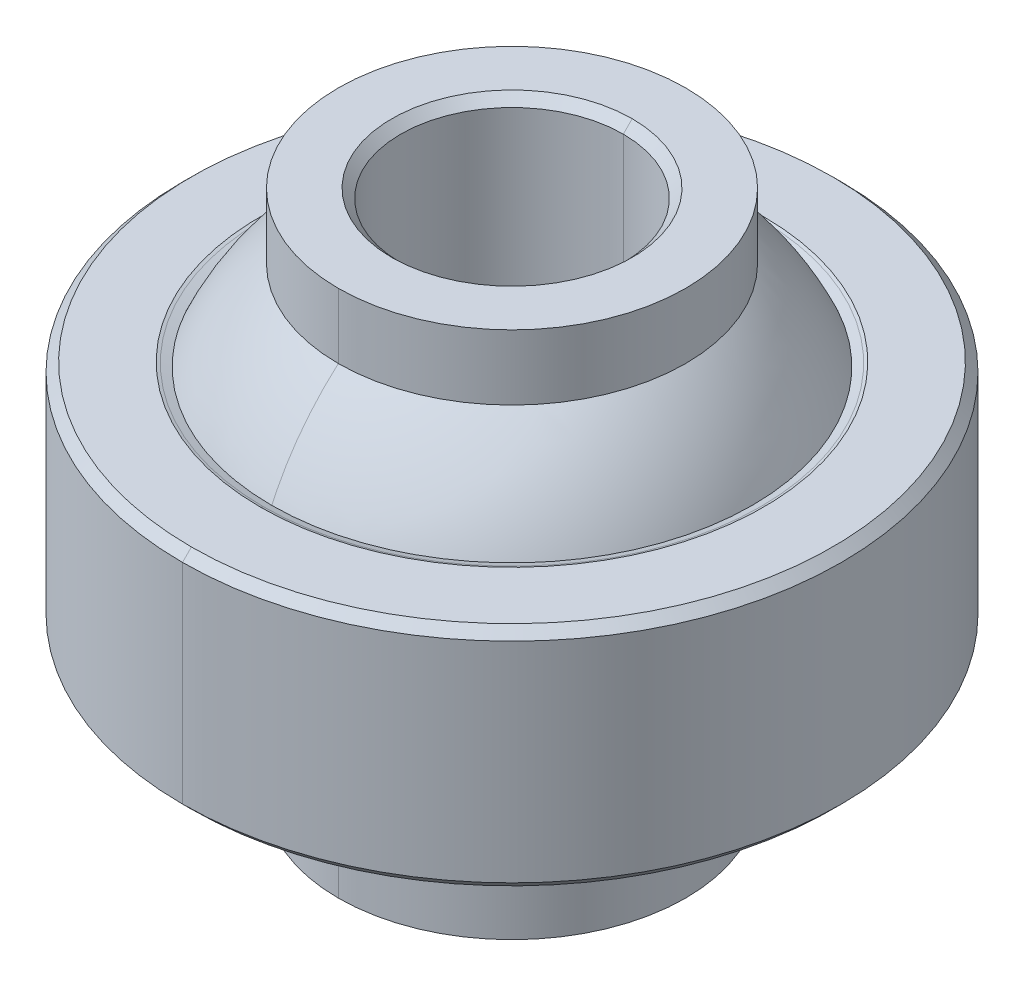
ISO-10303-21;
HEADER;
FILE_DESCRIPTION(('STEP AP214'),'2;1');
FILE_NAME('part.step','',(''),(''),'','','');
FILE_SCHEMA(('AUTOMOTIVE_DESIGN { 1 0 10303 214 1 1 1 1 }'));
ENDSEC;
DATA;
#1=APPLICATION_CONTEXT('core data for automotive mechanical design processes');
#2=APPLICATION_PROTOCOL_DEFINITION('international standard','automotive_design',2000,#1);
#3=PRODUCT_CONTEXT('',#1,'mechanical');
#4=PRODUCT('Part','Part','',(#3));
#5=PRODUCT_RELATED_PRODUCT_CATEGORY('part','',(#4));
#6=PRODUCT_DEFINITION_FORMATION('','',#4);
#7=PRODUCT_DEFINITION_CONTEXT('part definition',#1,'design');
#8=PRODUCT_DEFINITION('design','',#6,#7);
#9=PRODUCT_DEFINITION_SHAPE('','',#8);
#10=(LENGTH_UNIT() NAMED_UNIT(*) SI_UNIT(.MILLI.,.METRE.));
#11=(NAMED_UNIT(*) PLANE_ANGLE_UNIT() SI_UNIT($,.RADIAN.));
#12=(NAMED_UNIT(*) SI_UNIT($,.STERADIAN.) SOLID_ANGLE_UNIT());
#13=UNCERTAINTY_MEASURE_WITH_UNIT(LENGTH_MEASURE(1.E-05),#10,'distance_accuracy_value','');
#14=(GEOMETRIC_REPRESENTATION_CONTEXT(3) GLOBAL_UNCERTAINTY_ASSIGNED_CONTEXT((#13)) GLOBAL_UNIT_ASSIGNED_CONTEXT((#10,
#11,#12)) REPRESENTATION_CONTEXT('',''));
#15=CARTESIAN_POINT('',(0.,0.,0.));
#16=DIRECTION('',(0.,0.,1.));
#17=DIRECTION('',(1.,0.,0.));
#18=AXIS2_PLACEMENT_3D('',#15,#16,#17);
#19=CARTESIAN_POINT('',(0.,0.,0.));
#20=DIRECTION('',(0.,0.,1.));
#21=DIRECTION('',(1.,0.,0.));
#22=AXIS2_PLACEMENT_3D('',#19,#20,#21);
#23=SPHERICAL_SURFACE('',#22,7.5311);
#24=CARTESIAN_POINT('',(0.,0.,0.));
#25=DIRECTION('',(1.,0.,0.));
#26=DIRECTION('',(0.,0.,1.));
#27=AXIS2_PLACEMENT_3D('',#24,#25,#26);
#28=CIRCLE('',#27,7.5311);
#29=CARTESIAN_POINT('',(0.,-5.6732052853744,-4.953));
#30=VERTEX_POINT('',#29);
#31=CARTESIAN_POINT('',(0.,0.,-7.5311));
#32=VERTEX_POINT('',#31);
#33=EDGE_CURVE('P0_E162',#30,#32,#28,.T.);
#34=ORIENTED_EDGE('',*,*,#33,.T.);
#35=CARTESIAN_POINT('',(0.,0.,0.));
#36=DIRECTION('',(1.,0.,0.));
#37=DIRECTION('',(0.,0.,1.));
#38=AXIS2_PLACEMENT_3D('',#35,#36,#37);
#39=CIRCLE('',#38,7.5311);
#40=CARTESIAN_POINT('',(0.,5.6732052853744,-4.953));
#41=VERTEX_POINT('',#40);
#42=EDGE_CURVE('P0_E11',#32,#41,#39,.T.);
#43=ORIENTED_EDGE('',*,*,#42,.T.);
#44=CARTESIAN_POINT('',(0.,5.6732052853744,0.));
#45=DIRECTION('',(0.,-1.,0.));
#46=DIRECTION('',(0.,0.,-1.));
#47=AXIS2_PLACEMENT_3D('',#44,#45,#46);
#48=CIRCLE('',#47,4.953);
#49=CARTESIAN_POINT('',(0.,5.6732052853744,4.953));
#50=VERTEX_POINT('',#49);
#51=EDGE_CURVE('P0_E165',#41,#50,#48,.T.);
#52=ORIENTED_EDGE('',*,*,#51,.T.);
#53=CARTESIAN_POINT('',(0.,0.,0.));
#54=DIRECTION('',(1.,0.,0.));
#55=DIRECTION('',(0.,0.,1.));
#56=AXIS2_PLACEMENT_3D('',#53,#54,#55);
#57=CIRCLE('',#56,7.5311);
#58=CARTESIAN_POINT('',(0.,0.,7.5311));
#59=VERTEX_POINT('',#58);
#60=EDGE_CURVE('P0_E27',#50,#59,#57,.T.);
#61=ORIENTED_EDGE('',*,*,#60,.T.);
#62=CARTESIAN_POINT('',(0.,0.,0.));
#63=DIRECTION('',(1.,0.,0.));
#64=DIRECTION('',(0.,0.,1.));
#65=AXIS2_PLACEMENT_3D('',#62,#63,#64);
#66=CIRCLE('',#65,7.5311);
#67=CARTESIAN_POINT('',(0.,-5.6732052853744,4.953));
#68=VERTEX_POINT('',#67);
#69=EDGE_CURVE('P0_E159',#59,#68,#66,.T.);
#70=ORIENTED_EDGE('',*,*,#69,.T.);
#71=CARTESIAN_POINT('',(0.,-5.6732052853744,0.));
#72=DIRECTION('',(0.,1.,0.));
#73=DIRECTION('',(0.,0.,-1.));
#74=AXIS2_PLACEMENT_3D('',#71,#72,#73);
#75=CIRCLE('',#74,4.953);
#76=EDGE_CURVE('P0_E20',#68,#30,#75,.T.);
#77=ORIENTED_EDGE('',*,*,#76,.T.);
#78=EDGE_LOOP('',(#34,#43,#52,#61,#70,#77));
#79=FACE_BOUND('',#78,.T.);
#80=ADVANCED_FACE('P0_F16',(#79),#23,.T.);
#81=CARTESIAN_POINT('',(0.,0.,0.));
#82=DIRECTION('',(0.,0.,1.));
#83=DIRECTION('',(1.,0.,0.));
#84=AXIS2_PLACEMENT_3D('',#81,#82,#83);
#85=SPHERICAL_SURFACE('',#84,7.5311);
#86=ORIENTED_EDGE('',*,*,#33,.F.);
#87=CARTESIAN_POINT('',(0.,-5.6732052853744,0.));
#88=DIRECTION('',(0.,1.,0.));
#89=DIRECTION('',(0.,0.,-1.));
#90=AXIS2_PLACEMENT_3D('',#87,#88,#89);
#91=CIRCLE('',#90,4.953);
#92=EDGE_CURVE('P0_E151',#30,#68,#91,.T.);
#93=ORIENTED_EDGE('',*,*,#92,.T.);
#94=ORIENTED_EDGE('',*,*,#69,.F.);
#95=ORIENTED_EDGE('',*,*,#60,.F.);
#96=CARTESIAN_POINT('',(0.,5.6732052853744,0.));
#97=DIRECTION('',(0.,-1.,0.));
#98=DIRECTION('',(0.,0.,-1.));
#99=AXIS2_PLACEMENT_3D('',#96,#97,#98);
#100=CIRCLE('',#99,4.953);
#101=EDGE_CURVE('P0_E157',#50,#41,#100,.T.);
#102=ORIENTED_EDGE('',*,*,#101,.T.);
#103=ORIENTED_EDGE('',*,*,#42,.F.);
#104=EDGE_LOOP('',(#86,#93,#94,#95,#102,#103));
#105=FACE_BOUND('',#104,.T.);
#106=ADVANCED_FACE('P0_F245',(#105),#85,.T.);
#107=CARTESIAN_POINT('',(0.,0.,0.));
#108=DIRECTION('',(0.,1.,0.));
#109=DIRECTION('',(0.,0.,-1.));
#110=AXIS2_PLACEMENT_3D('',#107,#108,#109);
#111=CYLINDRICAL_SURFACE('',#110,4.953);
#112=DIRECTION('',(0.,1.,0.));
#113=VECTOR('',#112,1.);
#114=CARTESIAN_POINT('',(0.,0.,-4.953));
#115=LINE('',#114,#113);
#116=CARTESIAN_POINT('',(0.,7.5311,-4.953));
#117=VERTEX_POINT('',#116);
#118=EDGE_CURVE('P0_E154',#41,#117,#115,.T.);
#119=ORIENTED_EDGE('',*,*,#118,.T.);
#120=CARTESIAN_POINT('',(0.,7.5311,0.));
#121=DIRECTION('',(0.,1.,0.));
#122=DIRECTION('',(0.,0.,-1.));
#123=AXIS2_PLACEMENT_3D('',#120,#121,#122);
#124=CIRCLE('',#123,4.953);
#125=CARTESIAN_POINT('',(0.,7.5311,4.953));
#126=VERTEX_POINT('',#125);
#127=EDGE_CURVE('P0_E158',#126,#117,#124,.T.);
#128=ORIENTED_EDGE('',*,*,#127,.F.);
#129=DIRECTION('',(0.,-1.,0.));
#130=VECTOR('',#129,1.);
#131=CARTESIAN_POINT('',(0.,0.,4.953));
#132=LINE('',#131,#130);
#133=EDGE_CURVE('P0_E204',#126,#50,#132,.T.);
#134=ORIENTED_EDGE('',*,*,#133,.T.);
#135=ORIENTED_EDGE('',*,*,#51,.F.);
#136=EDGE_LOOP('',(#119,#128,#134,#135));
#137=FACE_BOUND('',#136,.T.);
#138=ADVANCED_FACE('P0_F243',(#137),#111,.T.);
#139=CARTESIAN_POINT('',(0.,0.,0.));
#140=DIRECTION('',(0.,1.,0.));
#141=DIRECTION('',(0.,0.,-1.));
#142=AXIS2_PLACEMENT_3D('',#139,#140,#141);
#143=CYLINDRICAL_SURFACE('',#142,4.953);
#144=DIRECTION('',(0.,1.,0.));
#145=VECTOR('',#144,1.);
#146=CARTESIAN_POINT('',(0.,0.,-4.953));
#147=LINE('',#146,#145);
#148=CARTESIAN_POINT('',(0.,-7.5311,-4.953));
#149=VERTEX_POINT('',#148);
#150=EDGE_CURVE('P0_E207',#149,#30,#147,.T.);
#151=ORIENTED_EDGE('',*,*,#150,.T.);
#152=ORIENTED_EDGE('',*,*,#76,.F.);
#153=DIRECTION('',(0.,-1.,0.));
#154=VECTOR('',#153,1.);
#155=CARTESIAN_POINT('',(0.,0.,4.953));
#156=LINE('',#155,#154);
#157=CARTESIAN_POINT('',(0.,-7.5311,4.953));
#158=VERTEX_POINT('',#157);
#159=EDGE_CURVE('P0_E150',#68,#158,#156,.T.);
#160=ORIENTED_EDGE('',*,*,#159,.T.);
#161=CARTESIAN_POINT('',(0.,-7.5311,0.));
#162=DIRECTION('',(0.,-1.,0.));
#163=DIRECTION('',(0.,0.,-1.));
#164=AXIS2_PLACEMENT_3D('',#161,#162,#163);
#165=CIRCLE('',#164,4.953);
#166=EDGE_CURVE('P0_E129',#149,#158,#165,.T.);
#167=ORIENTED_EDGE('',*,*,#166,.F.);
#168=EDGE_LOOP('',(#151,#152,#160,#167));
#169=FACE_BOUND('',#168,.T.);
#170=ADVANCED_FACE('P0_F251',(#169),#143,.T.);
#171=CARTESIAN_POINT('',(0.,0.,0.));
#172=DIRECTION('',(0.,1.,0.));
#173=DIRECTION('',(0.,0.,-1.));
#174=AXIS2_PLACEMENT_3D('',#171,#172,#173);
#175=CYLINDRICAL_SURFACE('',#174,4.953);
#176=ORIENTED_EDGE('',*,*,#150,.F.);
#177=CARTESIAN_POINT('',(0.,-7.5311,0.));
#178=DIRECTION('',(0.,-1.,0.));
#179=DIRECTION('',(0.,0.,-1.));
#180=AXIS2_PLACEMENT_3D('',#177,#178,#179);
#181=CIRCLE('',#180,4.953);
#182=EDGE_CURVE('P0_E217',#158,#149,#181,.T.);
#183=ORIENTED_EDGE('',*,*,#182,.F.);
#184=ORIENTED_EDGE('',*,*,#159,.F.);
#185=ORIENTED_EDGE('',*,*,#92,.F.);
#186=EDGE_LOOP('',(#176,#183,#184,#185));
#187=FACE_BOUND('',#186,.T.);
#188=ADVANCED_FACE('P0_F349',(#187),#175,.T.);
#189=CARTESIAN_POINT('',(0.,0.,0.));
#190=DIRECTION('',(0.,1.,0.));
#191=DIRECTION('',(0.,0.,-1.));
#192=AXIS2_PLACEMENT_3D('',#189,#190,#191);
#193=CYLINDRICAL_SURFACE('',#192,4.953);
#194=ORIENTED_EDGE('',*,*,#118,.F.);
#195=ORIENTED_EDGE('',*,*,#101,.F.);
#196=ORIENTED_EDGE('',*,*,#133,.F.);
#197=CARTESIAN_POINT('',(0.,7.5311,0.));
#198=DIRECTION('',(0.,1.,0.));
#199=DIRECTION('',(0.,0.,-1.));
#200=AXIS2_PLACEMENT_3D('',#197,#198,#199);
#201=CIRCLE('',#200,4.953);
#202=EDGE_CURVE('P0_E220',#117,#126,#201,.T.);
#203=ORIENTED_EDGE('',*,*,#202,.F.);
#204=EDGE_LOOP('',(#194,#195,#196,#203));
#205=FACE_BOUND('',#204,.T.);
#206=ADVANCED_FACE('P0_F240',(#205),#193,.T.);
#207=CARTESIAN_POINT('',(0.,7.5311,0.));
#208=DIRECTION('',(0.,1.,0.));
#209=DIRECTION('',(1.,0.,0.));
#210=AXIS2_PLACEMENT_3D('',#207,#208,#209);
#211=PLANE('',#210);
#212=ORIENTED_EDGE('',*,*,#202,.T.);
#213=ORIENTED_EDGE('',*,*,#127,.T.);
#214=EDGE_LOOP('',(#212,#213));
#215=FACE_BOUND('',#214,.T.);
#216=CARTESIAN_POINT('',(0.,7.5311,0.));
#217=DIRECTION('',(0.,-1.,0.));
#218=DIRECTION('',(0.,0.,-1.));
#219=AXIS2_PLACEMENT_3D('',#216,#217,#218);
#220=CIRCLE('',#219,3.429);
#221=CARTESIAN_POINT('',(0.,7.5311,-3.429));
#222=VERTEX_POINT('',#221);
#223=CARTESIAN_POINT('',(0.,7.5311,3.429));
#224=VERTEX_POINT('',#223);
#225=EDGE_CURVE('P0_E123',#222,#224,#220,.T.);
#226=ORIENTED_EDGE('',*,*,#225,.T.);
#227=CARTESIAN_POINT('',(0.,7.5311,0.));
#228=DIRECTION('',(0.,-1.,0.));
#229=DIRECTION('',(0.,0.,-1.));
#230=AXIS2_PLACEMENT_3D('',#227,#228,#229);
#231=CIRCLE('',#230,3.429);
#232=EDGE_CURVE('P0_E125',#224,#222,#231,.T.);
#233=ORIENTED_EDGE('',*,*,#232,.T.);
#234=EDGE_LOOP('',(#226,#233));
#235=FACE_BOUND('',#234,.T.);
#236=ADVANCED_FACE('P0_F124',(#215,#235),#211,.T.);
#237=CARTESIAN_POINT('',(0.,-7.5311,0.));
#238=DIRECTION('',(0.,-1.,0.));
#239=DIRECTION('',(0.,0.,-1.));
#240=AXIS2_PLACEMENT_3D('',#237,#238,#239);
#241=PLANE('',#240);
#242=ORIENTED_EDGE('',*,*,#166,.T.);
#243=ORIENTED_EDGE('',*,*,#182,.T.);
#244=EDGE_LOOP('',(#242,#243));
#245=FACE_BOUND('',#244,.T.);
#246=CARTESIAN_POINT('',(0.,-7.5311,0.));
#247=DIRECTION('',(0.,1.,0.));
#248=DIRECTION('',(0.,0.,-1.));
#249=AXIS2_PLACEMENT_3D('',#246,#247,#248);
#250=CIRCLE('',#249,3.429);
#251=CARTESIAN_POINT('',(0.,-7.5311,-3.429));
#252=VERTEX_POINT('',#251);
#253=CARTESIAN_POINT('',(0.,-7.5311,3.429));
#254=VERTEX_POINT('',#253);
#255=EDGE_CURVE('P0_E146',#252,#254,#250,.T.);
#256=ORIENTED_EDGE('',*,*,#255,.T.);
#257=CARTESIAN_POINT('',(0.,-7.5311,0.));
#258=DIRECTION('',(0.,1.,0.));
#259=DIRECTION('',(0.,0.,-1.));
#260=AXIS2_PLACEMENT_3D('',#257,#258,#259);
#261=CIRCLE('',#260,3.429);
#262=EDGE_CURVE('P0_E200',#254,#252,#261,.T.);
#263=ORIENTED_EDGE('',*,*,#262,.T.);
#264=EDGE_LOOP('',(#256,#263));
#265=FACE_BOUND('',#264,.T.);
#266=ADVANCED_FACE('P0_F278',(#245,#265),#241,.T.);
#267=CARTESIAN_POINT('',(0.,7.4041,0.));
#268=DIRECTION('',(0.,1.,0.));
#269=DIRECTION('',(0.,0.,-1.));
#270=AXIS2_PLACEMENT_3D('',#267,#268,#269);
#271=CONICAL_SURFACE('',#270,3.302,0.785398163397449);
#272=DIRECTION('',(0.,0.707106781186547,-0.707106781186548));
#273=VECTOR('',#272,1.);
#274=CARTESIAN_POINT('',(0.,7.4041,-3.302));
#275=LINE('',#274,#273);
#276=CARTESIAN_POINT('',(0.,7.2771,-3.175));
#277=VERTEX_POINT('',#276);
#278=EDGE_CURVE('P0_E138',#277,#222,#275,.T.);
#279=ORIENTED_EDGE('',*,*,#278,.F.);
#280=CARTESIAN_POINT('',(0.,7.2771,0.));
#281=DIRECTION('',(0.,1.,0.));
#282=DIRECTION('',(0.,0.,-1.));
#283=AXIS2_PLACEMENT_3D('',#280,#281,#282);
#284=CIRCLE('',#283,3.175);
#285=CARTESIAN_POINT('',(0.,7.2771,3.175));
#286=VERTEX_POINT('',#285);
#287=EDGE_CURVE('P0_E133',#286,#277,#284,.T.);
#288=ORIENTED_EDGE('',*,*,#287,.F.);
#289=DIRECTION('',(0.,-0.707106781186547,-0.707106781186548));
#290=VECTOR('',#289,1.);
#291=CARTESIAN_POINT('',(0.,7.4041,3.302));
#292=LINE('',#291,#290);
#293=EDGE_CURVE('P0_E116',#224,#286,#292,.T.);
#294=ORIENTED_EDGE('',*,*,#293,.F.);
#295=ORIENTED_EDGE('',*,*,#225,.F.);
#296=EDGE_LOOP('',(#279,#288,#294,#295));
#297=FACE_BOUND('',#296,.T.);
#298=ADVANCED_FACE('P0_F131',(#297),#271,.F.);
#299=CARTESIAN_POINT('',(0.,7.4041,0.));
#300=DIRECTION('',(0.,1.,0.));
#301=DIRECTION('',(0.,0.,-1.));
#302=AXIS2_PLACEMENT_3D('',#299,#300,#301);
#303=CONICAL_SURFACE('',#302,3.302,0.785398163397449);
#304=ORIENTED_EDGE('',*,*,#278,.T.);
#305=ORIENTED_EDGE('',*,*,#232,.F.);
#306=ORIENTED_EDGE('',*,*,#293,.T.);
#307=CARTESIAN_POINT('',(0.,7.2771,0.));
#308=DIRECTION('',(0.,1.,0.));
#309=DIRECTION('',(0.,0.,-1.));
#310=AXIS2_PLACEMENT_3D('',#307,#308,#309);
#311=CIRCLE('',#310,3.175);
#312=EDGE_CURVE('P0_E169',#277,#286,#311,.T.);
#313=ORIENTED_EDGE('',*,*,#312,.F.);
#314=EDGE_LOOP('',(#304,#305,#306,#313));
#315=FACE_BOUND('',#314,.T.);
#316=ADVANCED_FACE('P0_F137',(#315),#303,.F.);
#317=CARTESIAN_POINT('',(0.,-7.4041,0.));
#318=DIRECTION('',(0.,-1.,0.));
#319=DIRECTION('',(0.,0.,-1.));
#320=AXIS2_PLACEMENT_3D('',#317,#318,#319);
#321=CONICAL_SURFACE('',#320,3.302,0.785398163397449);
#322=DIRECTION('',(0.,-0.707106781186547,-0.707106781186548));
#323=VECTOR('',#322,1.);
#324=CARTESIAN_POINT('',(0.,-7.4041,-3.302));
#325=LINE('',#324,#323);
#326=CARTESIAN_POINT('',(0.,-7.2771,-3.175));
#327=VERTEX_POINT('',#326);
#328=EDGE_CURVE('P0_E194',#327,#252,#325,.T.);
#329=ORIENTED_EDGE('',*,*,#328,.F.);
#330=CARTESIAN_POINT('',(0.,-7.2771,0.));
#331=DIRECTION('',(0.,-1.,0.));
#332=DIRECTION('',(0.,0.,-1.));
#333=AXIS2_PLACEMENT_3D('',#330,#331,#332);
#334=CIRCLE('',#333,3.175);
#335=CARTESIAN_POINT('',(0.,-7.2771,3.175));
#336=VERTEX_POINT('',#335);
#337=EDGE_CURVE('P0_E168',#336,#327,#334,.T.);
#338=ORIENTED_EDGE('',*,*,#337,.F.);
#339=DIRECTION('',(0.,0.707106781186547,-0.707106781186548));
#340=VECTOR('',#339,1.);
#341=CARTESIAN_POINT('',(0.,-7.4041,3.302));
#342=LINE('',#341,#340);
#343=EDGE_CURVE('P0_E103',#254,#336,#342,.T.);
#344=ORIENTED_EDGE('',*,*,#343,.F.);
#345=ORIENTED_EDGE('',*,*,#255,.F.);
#346=EDGE_LOOP('',(#329,#338,#344,#345));
#347=FACE_BOUND('',#346,.T.);
#348=ADVANCED_FACE('P0_F290',(#347),#321,.F.);
#349=CARTESIAN_POINT('',(0.,-7.4041,0.));
#350=DIRECTION('',(0.,-1.,0.));
#351=DIRECTION('',(0.,0.,-1.));
#352=AXIS2_PLACEMENT_3D('',#349,#350,#351);
#353=CONICAL_SURFACE('',#352,3.302,0.785398163397449);
#354=ORIENTED_EDGE('',*,*,#328,.T.);
#355=ORIENTED_EDGE('',*,*,#262,.F.);
#356=ORIENTED_EDGE('',*,*,#343,.T.);
#357=CARTESIAN_POINT('',(0.,-7.2771,0.));
#358=DIRECTION('',(0.,-1.,0.));
#359=DIRECTION('',(0.,0.,-1.));
#360=AXIS2_PLACEMENT_3D('',#357,#358,#359);
#361=CIRCLE('',#360,3.175);
#362=EDGE_CURVE('P0_E178',#327,#336,#361,.T.);
#363=ORIENTED_EDGE('',*,*,#362,.F.);
#364=EDGE_LOOP('',(#354,#355,#356,#363));
#365=FACE_BOUND('',#364,.T.);
#366=ADVANCED_FACE('P0_F321',(#365),#353,.F.);
#367=CARTESIAN_POINT('',(0.,0.,0.));
#368=DIRECTION('',(0.,1.,0.));
#369=DIRECTION('',(0.,0.,-1.));
#370=AXIS2_PLACEMENT_3D('',#367,#368,#369);
#371=CYLINDRICAL_SURFACE('',#370,3.175);
#372=DIRECTION('',(0.,-1.,0.));
#373=VECTOR('',#372,1.);
#374=CARTESIAN_POINT('',(0.,0.,-3.175));
#375=LINE('',#374,#373);
#376=EDGE_CURVE('P0_E181',#277,#327,#375,.T.);
#377=ORIENTED_EDGE('',*,*,#376,.T.);
#378=ORIENTED_EDGE('',*,*,#362,.T.);
#379=DIRECTION('',(0.,1.,0.));
#380=VECTOR('',#379,1.);
#381=CARTESIAN_POINT('',(0.,0.,3.175));
#382=LINE('',#381,#380);
#383=EDGE_CURVE('P0_E166',#336,#286,#382,.T.);
#384=ORIENTED_EDGE('',*,*,#383,.T.);
#385=ORIENTED_EDGE('',*,*,#287,.T.);
#386=EDGE_LOOP('',(#377,#378,#384,#385));
#387=FACE_BOUND('',#386,.T.);
#388=ADVANCED_FACE('P0_F18',(#387),#371,.F.);
#389=CARTESIAN_POINT('',(0.,0.,0.));
#390=DIRECTION('',(0.,1.,0.));
#391=DIRECTION('',(0.,0.,-1.));
#392=AXIS2_PLACEMENT_3D('',#389,#390,#391);
#393=CYLINDRICAL_SURFACE('',#392,3.175);
#394=ORIENTED_EDGE('',*,*,#376,.F.);
#395=ORIENTED_EDGE('',*,*,#312,.T.);
#396=ORIENTED_EDGE('',*,*,#383,.F.);
#397=ORIENTED_EDGE('',*,*,#337,.T.);
#398=EDGE_LOOP('',(#394,#395,#396,#397));
#399=FACE_BOUND('',#398,.T.);
#400=ADVANCED_FACE('P0_F262',(#399),#393,.F.);
#401=CLOSED_SHELL('',(#80,#106,#138,#170,#188,#206,#236,#266,#298,#316,#348,#366,#388,#400));
#402=MANIFOLD_SOLID_BREP('P0_B1',#401);
#403=CARTESIAN_POINT('',(0.,0.,0.));
#404=DIRECTION('',(0.,1.,0.));
#405=DIRECTION('',(0.,0.,-1.));
#406=AXIS2_PLACEMENT_3D('',#403,#404,#405);
#407=CYLINDRICAL_SURFACE('',#406,9.398);
#408=DIRECTION('',(0.,1.,0.));
#409=VECTOR('',#408,1.);
#410=CARTESIAN_POINT('',(0.,0.,-9.398));
#411=LINE('',#410,#409);
#412=CARTESIAN_POINT('',(0.,-2.9845,-9.398));
#413=VERTEX_POINT('',#412);
#414=CARTESIAN_POINT('',(0.,2.9845,-9.398));
#415=VERTEX_POINT('',#414);
#416=EDGE_CURVE('P1_E31',#413,#415,#411,.T.);
#417=ORIENTED_EDGE('',*,*,#416,.F.);
#418=CARTESIAN_POINT('',(0.,-2.9845,0.));
#419=DIRECTION('',(0.,1.,0.));
#420=DIRECTION('',(0.,0.,-1.));
#421=AXIS2_PLACEMENT_3D('',#418,#419,#420);
#422=CIRCLE('',#421,9.398);
#423=CARTESIAN_POINT('',(0.,-2.9845,9.398));
#424=VERTEX_POINT('',#423);
#425=EDGE_CURVE('P1_E196',#413,#424,#422,.T.);
#426=ORIENTED_EDGE('',*,*,#425,.T.);
#427=DIRECTION('',(0.,-1.,0.));
#428=VECTOR('',#427,1.);
#429=CARTESIAN_POINT('',(0.,0.,9.398));
#430=LINE('',#429,#428);
#431=CARTESIAN_POINT('',(0.,2.9845,9.398));
#432=VERTEX_POINT('',#431);
#433=EDGE_CURVE('P1_E11',#432,#424,#430,.T.);
#434=ORIENTED_EDGE('',*,*,#433,.F.);
#435=CARTESIAN_POINT('',(0.,2.9845,0.));
#436=DIRECTION('',(0.,-1.,0.));
#437=DIRECTION('',(0.,0.,-1.));
#438=AXIS2_PLACEMENT_3D('',#435,#436,#437);
#439=CIRCLE('',#438,9.398);
#440=EDGE_CURVE('P1_E193',#432,#415,#439,.T.);
#441=ORIENTED_EDGE('',*,*,#440,.T.);
#442=EDGE_LOOP('',(#417,#426,#434,#441));
#443=FACE_BOUND('',#442,.T.);
#444=ADVANCED_FACE('P1_F17',(#443),#407,.T.);
#445=CARTESIAN_POINT('',(0.,0.,0.));
#446=DIRECTION('',(0.,1.,0.));
#447=DIRECTION('',(0.,0.,-1.));
#448=AXIS2_PLACEMENT_3D('',#445,#446,#447);
#449=CYLINDRICAL_SURFACE('',#448,9.398);
#450=ORIENTED_EDGE('',*,*,#416,.T.);
#451=CARTESIAN_POINT('',(0.,2.9845,0.));
#452=DIRECTION('',(0.,-1.,0.));
#453=DIRECTION('',(0.,0.,-1.));
#454=AXIS2_PLACEMENT_3D('',#451,#452,#453);
#455=CIRCLE('',#454,9.398);
#456=EDGE_CURVE('P1_E192',#415,#432,#455,.T.);
#457=ORIENTED_EDGE('',*,*,#456,.T.);
#458=ORIENTED_EDGE('',*,*,#433,.T.);
#459=CARTESIAN_POINT('',(0.,-2.9845,0.));
#460=DIRECTION('',(0.,1.,0.));
#461=DIRECTION('',(0.,0.,-1.));
#462=AXIS2_PLACEMENT_3D('',#459,#460,#461);
#463=CIRCLE('',#462,9.398);
#464=EDGE_CURVE('P1_E187',#424,#413,#463,.T.);
#465=ORIENTED_EDGE('',*,*,#464,.T.);
#466=EDGE_LOOP('',(#450,#457,#458,#465));
#467=FACE_BOUND('',#466,.T.);
#468=ADVANCED_FACE('P1_F237',(#467),#449,.T.);
#469=CARTESIAN_POINT('',(0.,-3.1115,0.));
#470=DIRECTION('',(0.,1.,0.));
#471=DIRECTION('',(0.,0.,-1.));
#472=AXIS2_PLACEMENT_3D('',#469,#470,#471);
#473=CONICAL_SURFACE('',#472,9.271,0.785398163397449);
#474=DIRECTION('',(0.,-0.707106781186547,0.707106781186548));
#475=VECTOR('',#474,1.);
#476=CARTESIAN_POINT('',(0.,-3.1115,-9.271));
#477=LINE('',#476,#475);
#478=CARTESIAN_POINT('',(0.,-3.2385,-9.144));
#479=VERTEX_POINT('',#478);
#480=EDGE_CURVE('P1_E203',#413,#479,#477,.T.);
#481=ORIENTED_EDGE('',*,*,#480,.T.);
#482=CARTESIAN_POINT('',(0.,-3.2385,0.));
#483=DIRECTION('',(0.,-1.,0.));
#484=DIRECTION('',(0.,0.,-1.));
#485=AXIS2_PLACEMENT_3D('',#482,#483,#484);
#486=CIRCLE('',#485,9.144);
#487=CARTESIAN_POINT('',(0.,-3.2385,9.144));
#488=VERTEX_POINT('',#487);
#489=EDGE_CURVE('P1_E206',#488,#479,#486,.T.);
#490=ORIENTED_EDGE('',*,*,#489,.F.);
#491=DIRECTION('',(0.,0.707106781186547,0.707106781186548));
#492=VECTOR('',#491,1.);
#493=CARTESIAN_POINT('',(0.,-3.1115,9.271));
#494=LINE('',#493,#492);
#495=EDGE_CURVE('P1_E182',#488,#424,#494,.T.);
#496=ORIENTED_EDGE('',*,*,#495,.T.);
#497=ORIENTED_EDGE('',*,*,#425,.F.);
#498=EDGE_LOOP('',(#481,#490,#496,#497));
#499=FACE_BOUND('',#498,.T.);
#500=ADVANCED_FACE('P1_F239',(#499),#473,.T.);
#501=CARTESIAN_POINT('',(0.,3.1115,0.));
#502=DIRECTION('',(0.,-1.,0.));
#503=DIRECTION('',(0.,0.,-1.));
#504=AXIS2_PLACEMENT_3D('',#501,#502,#503);
#505=CONICAL_SURFACE('',#504,9.271,0.785398163397449);
#506=DIRECTION('',(0.,0.707106781186547,0.707106781186548));
#507=VECTOR('',#506,1.);
#508=CARTESIAN_POINT('',(0.,3.1115,-9.271));
#509=LINE('',#508,#507);
#510=CARTESIAN_POINT('',(0.,3.2385,-9.144));
#511=VERTEX_POINT('',#510);
#512=EDGE_CURVE('P1_E186',#415,#511,#509,.T.);
#513=ORIENTED_EDGE('',*,*,#512,.F.);
#514=ORIENTED_EDGE('',*,*,#440,.F.);
#515=DIRECTION('',(0.,-0.707106781186547,0.707106781186548));
#516=VECTOR('',#515,1.);
#517=CARTESIAN_POINT('',(0.,3.1115,9.271));
#518=LINE('',#517,#516);
#519=CARTESIAN_POINT('',(0.,3.2385,9.144));
#520=VERTEX_POINT('',#519);
#521=EDGE_CURVE('P1_E188',#520,#432,#518,.T.);
#522=ORIENTED_EDGE('',*,*,#521,.F.);
#523=CARTESIAN_POINT('',(0.,3.2385,0.));
#524=DIRECTION('',(0.,1.,0.));
#525=DIRECTION('',(0.,0.,-1.));
#526=AXIS2_PLACEMENT_3D('',#523,#524,#525);
#527=CIRCLE('',#526,9.144);
#528=EDGE_CURVE('P1_E331',#511,#520,#527,.T.);
#529=ORIENTED_EDGE('',*,*,#528,.F.);
#530=EDGE_LOOP('',(#513,#514,#522,#529));
#531=FACE_BOUND('',#530,.T.);
#532=ADVANCED_FACE('P1_F242',(#531),#505,.T.);
#533=CARTESIAN_POINT('',(0.,3.1115,0.));
#534=DIRECTION('',(0.,-1.,0.));
#535=DIRECTION('',(0.,0.,-1.));
#536=AXIS2_PLACEMENT_3D('',#533,#534,#535);
#537=CONICAL_SURFACE('',#536,9.271,0.785398163397449);
#538=ORIENTED_EDGE('',*,*,#512,.T.);
#539=CARTESIAN_POINT('',(0.,3.2385,0.));
#540=DIRECTION('',(0.,1.,0.));
#541=DIRECTION('',(0.,0.,-1.));
#542=AXIS2_PLACEMENT_3D('',#539,#540,#541);
#543=CIRCLE('',#542,9.144);
#544=EDGE_CURVE('P1_E327',#520,#511,#543,.T.);
#545=ORIENTED_EDGE('',*,*,#544,.F.);
#546=ORIENTED_EDGE('',*,*,#521,.T.);
#547=ORIENTED_EDGE('',*,*,#456,.F.);
#548=EDGE_LOOP('',(#538,#545,#546,#547));
#549=FACE_BOUND('',#548,.T.);
#550=ADVANCED_FACE('P1_F244',(#549),#537,.T.);
#551=CARTESIAN_POINT('',(0.,-3.1115,0.));
#552=DIRECTION('',(0.,1.,0.));
#553=DIRECTION('',(0.,0.,-1.));
#554=AXIS2_PLACEMENT_3D('',#551,#552,#553);
#555=CONICAL_SURFACE('',#554,9.271,0.785398163397449);
#556=ORIENTED_EDGE('',*,*,#480,.F.);
#557=ORIENTED_EDGE('',*,*,#464,.F.);
#558=ORIENTED_EDGE('',*,*,#495,.F.);
#559=CARTESIAN_POINT('',(0.,-3.2385,0.));
#560=DIRECTION('',(0.,-1.,0.));
#561=DIRECTION('',(0.,0.,-1.));
#562=AXIS2_PLACEMENT_3D('',#559,#560,#561);
#563=CIRCLE('',#562,9.144);
#564=EDGE_CURVE('P1_E316',#479,#488,#563,.T.);
#565=ORIENTED_EDGE('',*,*,#564,.F.);
#566=EDGE_LOOP('',(#556,#557,#558,#565));
#567=FACE_BOUND('',#566,.T.);
#568=ADVANCED_FACE('P1_F247',(#567),#555,.T.);
#569=CARTESIAN_POINT('',(0.,-3.2385,0.));
#570=DIRECTION('',(0.,-1.,0.));
#571=DIRECTION('',(0.,0.,-1.));
#572=AXIS2_PLACEMENT_3D('',#569,#570,#571);
#573=PLANE('',#572);
#574=ORIENTED_EDGE('',*,*,#564,.T.);
#575=ORIENTED_EDGE('',*,*,#489,.T.);
#576=EDGE_LOOP('',(#574,#575));
#577=FACE_BOUND('',#576,.T.);
#578=CARTESIAN_POINT('',(0.,-3.2385,0.));
#579=DIRECTION('',(0.,1.,0.));
#580=DIRECTION('',(0.,0.,-1.));
#581=AXIS2_PLACEMENT_3D('',#578,#579,#580);
#582=CIRCLE('',#581,7.17578914510781);
#583=CARTESIAN_POINT('',(0.,-3.2385,-7.17578914510781));
#584=VERTEX_POINT('',#583);
#585=CARTESIAN_POINT('',(0.,-3.2385,7.17578914510781));
#586=VERTEX_POINT('',#585);
#587=EDGE_CURVE('P1_E78',#584,#586,#582,.T.);
#588=ORIENTED_EDGE('',*,*,#587,.T.);
#589=CARTESIAN_POINT('',(0.,-3.2385,0.));
#590=DIRECTION('',(0.,1.,0.));
#591=DIRECTION('',(0.,0.,-1.));
#592=AXIS2_PLACEMENT_3D('',#589,#590,#591);
#593=CIRCLE('',#592,7.17578914510781);
#594=EDGE_CURVE('P1_E209',#586,#584,#593,.T.);
#595=ORIENTED_EDGE('',*,*,#594,.T.);
#596=EDGE_LOOP('',(#588,#595));
#597=FACE_BOUND('',#596,.T.);
#598=ADVANCED_FACE('P1_F321',(#577,#597),#573,.T.);
#599=CARTESIAN_POINT('',(0.,3.2385,0.));
#600=DIRECTION('',(0.,1.,0.));
#601=DIRECTION('',(1.,0.,0.));
#602=AXIS2_PLACEMENT_3D('',#599,#600,#601);
#603=PLANE('',#602);
#604=ORIENTED_EDGE('',*,*,#528,.T.);
#605=ORIENTED_EDGE('',*,*,#544,.T.);
#606=EDGE_LOOP('',(#604,#605));
#607=FACE_BOUND('',#606,.T.);
#608=CARTESIAN_POINT('',(0.,3.2385,0.));
#609=DIRECTION('',(0.,-1.,0.));
#610=DIRECTION('',(0.,0.,-1.));
#611=AXIS2_PLACEMENT_3D('',#608,#609,#610);
#612=CIRCLE('',#611,7.17578914510781);
#613=CARTESIAN_POINT('',(0.,3.2385,-7.17578914510781));
#614=VERTEX_POINT('',#613);
#615=CARTESIAN_POINT('',(0.,3.2385,7.17578914510781));
#616=VERTEX_POINT('',#615);
#617=EDGE_CURVE('P1_E99',#614,#616,#612,.T.);
#618=ORIENTED_EDGE('',*,*,#617,.T.);
#619=CARTESIAN_POINT('',(0.,3.2385,0.));
#620=DIRECTION('',(0.,-1.,0.));
#621=DIRECTION('',(0.,0.,-1.));
#622=AXIS2_PLACEMENT_3D('',#619,#620,#621);
#623=CIRCLE('',#622,7.17578914510781);
#624=EDGE_CURVE('P1_E334',#616,#614,#623,.T.);
#625=ORIENTED_EDGE('',*,*,#624,.T.);
#626=EDGE_LOOP('',(#618,#625));
#627=FACE_BOUND('',#626,.T.);
#628=ADVANCED_FACE('P1_F347',(#607,#627),#603,.T.);
#629=CARTESIAN_POINT('',(0.,-3.16997259421795,0.));
#630=DIRECTION('',(0.,-1.,0.));
#631=DIRECTION('',(0.,0.,-1.));
#632=AXIS2_PLACEMENT_3D('',#629,#630,#631);
#633=CONICAL_SURFACE('',#632,6.98751164510781,1.22173047639603);
#634=DIRECTION('',(0.,0.342020143325669,0.939692620785908));
#635=VECTOR('',#634,1.);
#636=CARTESIAN_POINT('',(0.,-3.16997259421795,-6.98751164510781));
#637=LINE('',#636,#635);
#638=CARTESIAN_POINT('',(0.,-3.20846633095641,-7.09327231758719));
#639=VERTEX_POINT('',#638);
#640=EDGE_CURVE('P1_E199',#584,#639,#637,.T.);
#641=ORIENTED_EDGE('',*,*,#640,.T.);
#642=CARTESIAN_POINT('',(0.,-3.20846633095642,0.));
#643=DIRECTION('',(0.,1.,0.));
#644=DIRECTION('',(0.,0.,-1.));
#645=AXIS2_PLACEMENT_3D('',#642,#643,#644);
#646=CIRCLE('',#645,7.09327231758719);
#647=CARTESIAN_POINT('',(-7.09326597717362,-3.20848033323768,0.));
#648=VERTEX_POINT('',#647);
#649=EDGE_CURVE('P1_E366',#639,#648,#646,.T.);
#650=ORIENTED_EDGE('',*,*,#649,.T.);
#651=CARTESIAN_POINT('',(0.,-3.20846633095642,0.));
#652=DIRECTION('',(0.,1.,0.));
#653=DIRECTION('',(-1.,0.,0.));
#654=AXIS2_PLACEMENT_3D('',#651,#652,#653);
#655=CIRCLE('',#654,7.09327231758719);
#656=CARTESIAN_POINT('',(0.,-3.20846633095641,7.09327231758719));
#657=VERTEX_POINT('',#656);
#658=EDGE_CURVE('P1_E402',#648,#657,#655,.T.);
#659=ORIENTED_EDGE('',*,*,#658,.T.);
#660=DIRECTION('',(0.,-0.342020143325669,0.939692620785908));
#661=VECTOR('',#660,1.);
#662=CARTESIAN_POINT('',(0.,-3.16997259421795,6.98751164510781));
#663=LINE('',#662,#661);
#664=EDGE_CURVE('P1_E211',#657,#586,#663,.T.);
#665=ORIENTED_EDGE('',*,*,#664,.T.);
#666=ORIENTED_EDGE('',*,*,#587,.F.);
#667=EDGE_LOOP('',(#641,#650,#659,#665,#666));
#668=FACE_BOUND('',#667,.T.);
#669=ADVANCED_FACE('P1_F236',(#668),#633,.F.);
#670=CARTESIAN_POINT('',(0.,-3.16997259421795,0.));
#671=DIRECTION('',(0.,-1.,0.));
#672=DIRECTION('',(0.,0.,-1.));
#673=AXIS2_PLACEMENT_3D('',#670,#671,#672);
#674=CONICAL_SURFACE('',#673,6.98751164510781,1.22173047639603);
#675=ORIENTED_EDGE('',*,*,#640,.F.);
#676=ORIENTED_EDGE('',*,*,#594,.F.);
#677=ORIENTED_EDGE('',*,*,#664,.F.);
#678=CARTESIAN_POINT('',(0.,-3.20846633095642,0.));
#679=DIRECTION('',(0.,1.,0.));
#680=DIRECTION('',(0.,0.,1.));
#681=AXIS2_PLACEMENT_3D('',#678,#679,#680);
#682=CIRCLE('',#681,7.09327231758719);
#683=EDGE_CURVE('P1_E218',#657,#639,#682,.T.);
#684=ORIENTED_EDGE('',*,*,#683,.T.);
#685=EDGE_LOOP('',(#675,#676,#677,#684));
#686=FACE_BOUND('',#685,.T.);
#687=ADVANCED_FACE('P1_F225',(#686),#674,.F.);
#688=CARTESIAN_POINT('',(0.,3.16997259421795,0.));
#689=DIRECTION('',(0.,1.,0.));
#690=DIRECTION('',(0.,0.,-1.));
#691=AXIS2_PLACEMENT_3D('',#688,#689,#690);
#692=CONICAL_SURFACE('',#691,6.98751164510781,1.22173047639603);
#693=DIRECTION('',(0.,-0.342020143325669,0.939692620785908));
#694=VECTOR('',#693,1.);
#695=CARTESIAN_POINT('',(0.,3.16997259421794,-6.98751164510781));
#696=LINE('',#695,#694);
#697=CARTESIAN_POINT('',(0.,3.20846633095642,-7.09327231758719));
#698=VERTEX_POINT('',#697);
#699=EDGE_CURVE('P1_E336',#614,#698,#696,.T.);
#700=ORIENTED_EDGE('',*,*,#699,.T.);
#701=CARTESIAN_POINT('',(0.,3.20846633095642,0.));
#702=DIRECTION('',(0.,-1.,0.));
#703=DIRECTION('',(0.,0.,-1.));
#704=AXIS2_PLACEMENT_3D('',#701,#702,#703);
#705=CIRCLE('',#704,7.09327231758719);
#706=CARTESIAN_POINT('',(0.,3.20846633095642,7.09327231758719));
#707=VERTEX_POINT('',#706);
#708=EDGE_CURVE('P1_E294',#698,#707,#705,.T.);
#709=ORIENTED_EDGE('',*,*,#708,.T.);
#710=DIRECTION('',(0.,0.342020143325669,0.939692620785908));
#711=VECTOR('',#710,1.);
#712=CARTESIAN_POINT('',(0.,3.16997259421795,6.98751164510781));
#713=LINE('',#712,#711);
#714=EDGE_CURVE('P1_E200',#707,#616,#713,.T.);
#715=ORIENTED_EDGE('',*,*,#714,.T.);
#716=ORIENTED_EDGE('',*,*,#617,.F.);
#717=EDGE_LOOP('',(#700,#709,#715,#716));
#718=FACE_BOUND('',#717,.T.);
#719=ADVANCED_FACE('P1_F235',(#718),#692,.F.);
#720=CARTESIAN_POINT('',(0.,3.16997259421795,0.));
#721=DIRECTION('',(0.,1.,0.));
#722=DIRECTION('',(0.,0.,-1.));
#723=AXIS2_PLACEMENT_3D('',#720,#721,#722);
#724=CONICAL_SURFACE('',#723,6.98751164510781,1.22173047639603);
#725=ORIENTED_EDGE('',*,*,#699,.F.);
#726=ORIENTED_EDGE('',*,*,#624,.F.);
#727=ORIENTED_EDGE('',*,*,#714,.F.);
#728=CARTESIAN_POINT('',(0.,3.20846633095642,0.));
#729=DIRECTION('',(0.,-1.,0.));
#730=DIRECTION('',(0.,0.,1.));
#731=AXIS2_PLACEMENT_3D('',#728,#729,#730);
#732=CIRCLE('',#731,7.09327231758719);
#733=CARTESIAN_POINT('',(-7.09326597717362,3.20848033323768,0.));
#734=VERTEX_POINT('',#733);
#735=EDGE_CURVE('P1_E292',#707,#734,#732,.T.);
#736=ORIENTED_EDGE('',*,*,#735,.T.);
#737=CARTESIAN_POINT('',(0.,3.20846633095642,0.));
#738=DIRECTION('',(0.,-1.,0.));
#739=DIRECTION('',(-1.,0.,0.));
#740=AXIS2_PLACEMENT_3D('',#737,#738,#739);
#741=CIRCLE('',#740,7.09327231758719);
#742=EDGE_CURVE('P1_E282',#734,#698,#741,.T.);
#743=ORIENTED_EDGE('',*,*,#742,.T.);
#744=EDGE_LOOP('',(#725,#726,#727,#736,#743));
#745=FACE_BOUND('',#744,.T.);
#746=ADVANCED_FACE('P1_F255',(#745),#724,.F.);
#747=CARTESIAN_POINT('',(0.,-1.93332228878696,0.));
#748=DIRECTION('',(0.,-1.,0.));
#749=DIRECTION('',(1.,0.,0.));
#750=AXIS2_PLACEMENT_3D('',#747,#748,#749);
#751=CONICAL_SURFACE('',#750,3.58789457255391,1.22190500932123);
#752=CARTESIAN_POINT('',(0.,-3.12138692190335,0.));
#753=DIRECTION('',(0.,-1.,0.));
#754=DIRECTION('',(1.,0.,0.));
#755=AXIS2_PLACEMENT_3D('',#752,#753,#754);
#756=CIRCLE('',#755,6.85384878888803);
#757=CARTESIAN_POINT('',(-6.85384878888803,-3.12138692190335,0.));
#758=VERTEX_POINT('',#757);
#759=CARTESIAN_POINT('',(6.85384878888803,-3.12138692190335,0.));
#760=VERTEX_POINT('',#759);
#761=EDGE_CURVE('P1_E151',#758,#760,#756,.T.);
#762=ORIENTED_EDGE('',*,*,#761,.F.);
#763=CARTESIAN_POINT('',(0.,-3.12138692190335,0.));
#764=DIRECTION('',(0.,-1.,0.));
#765=DIRECTION('',(1.,0.,0.));
#766=AXIS2_PLACEMENT_3D('',#763,#764,#765);
#767=CIRCLE('',#766,6.85384878888803);
#768=EDGE_CURVE('P1_E163',#760,#758,#767,.T.);
#769=ORIENTED_EDGE('',*,*,#768,.F.);
#770=EDGE_LOOP('',(#762,#769));
#771=FACE_BOUND('',#770,.T.);
#772=ORIENTED_EDGE('',*,*,#658,.F.);
#773=ORIENTED_EDGE('',*,*,#649,.F.);
#774=ORIENTED_EDGE('',*,*,#683,.F.);
#775=EDGE_LOOP('',(#772,#773,#774));
#776=FACE_BOUND('',#775,.T.);
#777=ADVANCED_FACE('P1_F165',(#771,#776),#751,.F.);
#778=CARTESIAN_POINT('',(0.,1.93332228878696,0.));
#779=DIRECTION('',(0.,1.,0.));
#780=DIRECTION('',(1.,0.,0.));
#781=AXIS2_PLACEMENT_3D('',#778,#779,#780);
#782=CONICAL_SURFACE('',#781,3.58789457255391,1.22190500932123);
#783=CARTESIAN_POINT('',(0.,3.12138692190335,0.));
#784=DIRECTION('',(0.,1.,0.));
#785=DIRECTION('',(1.,0.,0.));
#786=AXIS2_PLACEMENT_3D('',#783,#784,#785);
#787=CIRCLE('',#786,6.85384878888803);
#788=CARTESIAN_POINT('',(-6.85384878888803,3.12138692190335,0.));
#789=VERTEX_POINT('',#788);
#790=CARTESIAN_POINT('',(6.85384878888803,3.12138692190335,0.));
#791=VERTEX_POINT('',#790);
#792=EDGE_CURVE('P1_E171',#789,#791,#787,.T.);
#793=ORIENTED_EDGE('',*,*,#792,.F.);
#794=CARTESIAN_POINT('',(0.,3.12138692190335,0.));
#795=DIRECTION('',(0.,1.,0.));
#796=DIRECTION('',(1.,0.,0.));
#797=AXIS2_PLACEMENT_3D('',#794,#795,#796);
#798=CIRCLE('',#797,6.85384878888803);
#799=EDGE_CURVE('P1_E162',#791,#789,#798,.T.);
#800=ORIENTED_EDGE('',*,*,#799,.F.);
#801=EDGE_LOOP('',(#793,#800));
#802=FACE_BOUND('',#801,.T.);
#803=ORIENTED_EDGE('',*,*,#742,.F.);
#804=ORIENTED_EDGE('',*,*,#735,.F.);
#805=ORIENTED_EDGE('',*,*,#708,.F.);
#806=EDGE_LOOP('',(#803,#804,#805));
#807=FACE_BOUND('',#806,.T.);
#808=ADVANCED_FACE('P1_F250',(#802,#807),#782,.F.);
#809=CARTESIAN_POINT('',(0.,-7.5242173600733,0.));
#810=CARTESIAN_POINT('',(0.,-7.5242173600733,0.));
#811=CARTESIAN_POINT('',(0.,-7.5242173600733,0.));
#812=CARTESIAN_POINT('',(0.,-7.5242173600733,0.));
#813=CARTESIAN_POINT('',(0.,-7.5242173600733,0.));
#814=CARTESIAN_POINT('',(-4.34749624410656,-7.5286201995707,0.));
#815=CARTESIAN_POINT('',(-4.34749624410655,-7.5286201995707,-4.34749624410655));
#816=CARTESIAN_POINT('',(0.,-7.52862019957072,-4.34749624410656));
#817=CARTESIAN_POINT('',(4.34749624410655,-7.52862019957072,-4.34749624410655));
#818=CARTESIAN_POINT('',(4.34749624410655,-7.52862019957072,0.));
#819=CARTESIAN_POINT('',(-6.52251634750104,-3.76431009978536,0.));
#820=CARTESIAN_POINT('',(-6.52251634750104,-3.76431009978536,-6.52251634750104));
#821=CARTESIAN_POINT('',(0.,-3.76431009978536,-6.52251634750104));
#822=CARTESIAN_POINT('',(6.52251634750104,-3.76431009978536,-6.52251634750104));
#823=CARTESIAN_POINT('',(6.52251634750104,-3.76431009978536,0.));
#824=CARTESIAN_POINT('',(-8.69753645089553,0.,0.));
#825=CARTESIAN_POINT('',(-8.69753645089554,0.,-8.69753645089554));
#826=CARTESIAN_POINT('',(0.,0.,-8.69753645089553));
#827=CARTESIAN_POINT('',(8.69753645089554,0.,-8.69753645089554));
#828=CARTESIAN_POINT('',(8.69753645089553,0.,0.));
#829=CARTESIAN_POINT('',(-6.52251634750104,3.76431009978537,0.));
#830=CARTESIAN_POINT('',(-6.52251634750104,3.76431009978537,-6.52251634750104));
#831=CARTESIAN_POINT('',(0.,3.76431009978537,-6.52251634750104));
#832=CARTESIAN_POINT('',(6.52251634750104,3.76431009978537,-6.52251634750104));
#833=CARTESIAN_POINT('',(6.52251634750104,3.76431009978537,0.));
#834=CARTESIAN_POINT('',(-4.34749624410656,7.52862019957073,0.));
#835=CARTESIAN_POINT('',(-4.34749624410655,7.52862019957073,-4.34749624410655));
#836=CARTESIAN_POINT('',(0.,7.52862019957073,-4.34749624410656));
#837=CARTESIAN_POINT('',(4.34749624410656,7.52862019957073,-4.34749624410655));
#838=CARTESIAN_POINT('',(4.34749624410656,7.52862019957073,0.));
#839=CARTESIAN_POINT('',(0.,7.52421736007331,0.));
#840=CARTESIAN_POINT('',(0.,7.52421736007332,0.));
#841=CARTESIAN_POINT('',(0.,7.52421736007331,0.));
#842=CARTESIAN_POINT('',(0.,7.52421736007332,0.));
#843=CARTESIAN_POINT('',(0.,7.52421736007331,0.));
#844=(BOUNDED_SURFACE() B_SPLINE_SURFACE(2,2,((#809,#810,#811,#812,#813),(#814,#815,#816,#817,
#818),(#819,#820,#821,#822,#823),(#824,#825,#826,#827,#828),(#829,#830,#831,#832,#833),(#834,
#835,#836,#837,#838),(#839,#840,#841,#842,#843)),.UNSPECIFIED.,.F.,.F.,
.F.) B_SPLINE_SURFACE_WITH_KNOTS((3,2,2,3),(3,2,3),(1.56978359722712,2.6176563014689,
3.66552900571068,4.71340170995247),(3.14159265358979,4.71238898038469,6.28318530717959),
.UNSPECIFIED.) GEOMETRIC_REPRESENTATION_ITEM() RATIONAL_B_SPLINE_SURFACE(((1.,0.707106781186548,
1.,0.707106781186548,1.),(0.865856566181128,0.612253049481574,0.865856566181128,
0.612253049481574,0.865856566181128),(1.,0.707106781186548,1.,0.707106781186548,1.),
(0.865856566181127,0.612253049481573,0.865856566181127,0.612253049481573,0.865856566181127),(1.,
0.707106781186548,1.,0.707106781186548,1.),(0.865856566181127,0.612253049481573,
0.865856566181127,0.612253049481573,0.865856566181127),(1.,0.707106781186548,1.,
0.707106781186548,1.))) REPRESENTATION_ITEM('') SURFACE());
#845=CARTESIAN_POINT('',(-0.00761999999999916,0.,0.));
#846=DIRECTION('',(0.,0.,-1.));
#847=DIRECTION('',(-1.,0.,0.));
#848=AXIS2_PLACEMENT_3D('',#845,#846,#847);
#849=CIRCLE('',#848,7.52422121857329);
#850=EDGE_CURVE('P1_E158',#758,#789,#849,.T.);
#851=CARTESIAN_POINT('',(0.00761999999999916,0.,0.));
#852=DIRECTION('',(0.,0.,-1.));
#853=DIRECTION('',(1.,0.,0.));
#854=AXIS2_PLACEMENT_3D('',#851,#852,#853);
#855=CIRCLE('',#854,7.52422121857329);
#856=EDGE_CURVE('P1_E155',#791,#760,#855,.T.);
#857=ORIENTED_EDGE('',*,*,#850,.F.);
#858=ORIENTED_EDGE('',*,*,#761,.T.);
#859=ORIENTED_EDGE('',*,*,#856,.F.);
#860=ORIENTED_EDGE('',*,*,#799,.T.);
#861=EDGE_LOOP('',(#857,#858,#859,#860));
#862=FACE_BOUND('',#861,.T.);
#863=ADVANCED_FACE('P1_F153',(#862),#844,.F.);
#864=CARTESIAN_POINT('',(0.,-7.5242173600733,0.));
#865=CARTESIAN_POINT('',(0.,-7.5242173600733,0.));
#866=CARTESIAN_POINT('',(0.,-7.5242173600733,0.));
#867=CARTESIAN_POINT('',(0.,-7.5242173600733,0.));
#868=CARTESIAN_POINT('',(0.,-7.5242173600733,0.));
#869=CARTESIAN_POINT('',(4.34749624410655,-7.52862019957072,0.));
#870=CARTESIAN_POINT('',(4.34749624410655,-7.52862019957072,4.34749624410655));
#871=CARTESIAN_POINT('',(0.,-7.52862019957072,4.34749624410655));
#872=CARTESIAN_POINT('',(-4.34749624410655,-7.5286201995707,4.34749624410655));
#873=CARTESIAN_POINT('',(-4.34749624410656,-7.5286201995707,0.));
#874=CARTESIAN_POINT('',(6.52251634750104,-3.76431009978536,0.));
#875=CARTESIAN_POINT('',(6.52251634750104,-3.76431009978536,6.52251634750104));
#876=CARTESIAN_POINT('',(0.,-3.76431009978536,6.52251634750104));
#877=CARTESIAN_POINT('',(-6.52251634750104,-3.76431009978536,6.52251634750104));
#878=CARTESIAN_POINT('',(-6.52251634750104,-3.76431009978536,0.));
#879=CARTESIAN_POINT('',(8.69753645089553,0.,0.));
#880=CARTESIAN_POINT('',(8.69753645089554,0.,8.69753645089554));
#881=CARTESIAN_POINT('',(0.,0.,8.69753645089553));
#882=CARTESIAN_POINT('',(-8.69753645089554,0.,8.69753645089554));
#883=CARTESIAN_POINT('',(-8.69753645089553,0.,0.));
#884=CARTESIAN_POINT('',(6.52251634750104,3.76431009978537,0.));
#885=CARTESIAN_POINT('',(6.52251634750104,3.76431009978537,6.52251634750104));
#886=CARTESIAN_POINT('',(0.,3.76431009978537,6.52251634750104));
#887=CARTESIAN_POINT('',(-6.52251634750104,3.76431009978537,6.52251634750104));
#888=CARTESIAN_POINT('',(-6.52251634750104,3.76431009978537,0.));
#889=CARTESIAN_POINT('',(4.34749624410656,7.52862019957073,0.));
#890=CARTESIAN_POINT('',(4.34749624410656,7.52862019957073,4.34749624410656));
#891=CARTESIAN_POINT('',(0.,7.52862019957073,4.34749624410656));
#892=CARTESIAN_POINT('',(-4.34749624410655,7.52862019957073,4.34749624410656));
#893=CARTESIAN_POINT('',(-4.34749624410656,7.52862019957073,0.));
#894=CARTESIAN_POINT('',(0.,7.52421736007331,0.));
#895=CARTESIAN_POINT('',(0.,7.52421736007332,0.));
#896=CARTESIAN_POINT('',(0.,7.52421736007331,0.));
#897=CARTESIAN_POINT('',(0.,7.52421736007332,0.));
#898=CARTESIAN_POINT('',(0.,7.52421736007331,0.));
#899=(BOUNDED_SURFACE() B_SPLINE_SURFACE(2,2,((#864,#865,#866,#867,#868),(#869,#870,#871,#872,
#873),(#874,#875,#876,#877,#878),(#879,#880,#881,#882,#883),(#884,#885,#886,#887,#888),(#889,
#890,#891,#892,#893),(#894,#895,#896,#897,#898)),.UNSPECIFIED.,.F.,.F.,
.F.) B_SPLINE_SURFACE_WITH_KNOTS((3,2,2,3),(3,2,3),(1.56978359722712,2.6176563014689,
3.66552900571068,4.71340170995247),(0.,1.5707963267949,3.14159265358979),
.UNSPECIFIED.) GEOMETRIC_REPRESENTATION_ITEM() RATIONAL_B_SPLINE_SURFACE(((1.,0.707106781186548,
1.,0.707106781186548,1.),(0.865856566181128,0.612253049481574,0.865856566181128,
0.612253049481574,0.865856566181128),(1.,0.707106781186548,1.,0.707106781186548,1.),
(0.865856566181127,0.612253049481573,0.865856566181127,0.612253049481573,0.865856566181127),(1.,
0.707106781186548,1.,0.707106781186548,1.),(0.865856566181127,0.612253049481573,
0.865856566181127,0.612253049481573,0.865856566181127),(1.,0.707106781186548,1.,
0.707106781186548,1.))) REPRESENTATION_ITEM('') SURFACE());
#900=ORIENTED_EDGE('',*,*,#850,.T.);
#901=ORIENTED_EDGE('',*,*,#792,.T.);
#902=ORIENTED_EDGE('',*,*,#856,.T.);
#903=ORIENTED_EDGE('',*,*,#768,.T.);
#904=EDGE_LOOP('',(#900,#901,#902,#903));
#905=FACE_BOUND('',#904,.T.);
#906=ADVANCED_FACE('P1_F19',(#905),#899,.F.);
#907=CLOSED_SHELL('',(#444,#468,#500,#532,#550,#568,#598,#628,#669,#687,#719,#746,#777,#808,
#863,#906));
#908=MANIFOLD_SOLID_BREP('P1_B1',#907);
#909=ADVANCED_BREP_SHAPE_REPRESENTATION('',(#18,#402,#908),#14);
#910=SHAPE_DEFINITION_REPRESENTATION(#9,#909);
ENDSEC;
END-ISO-10303-21;
